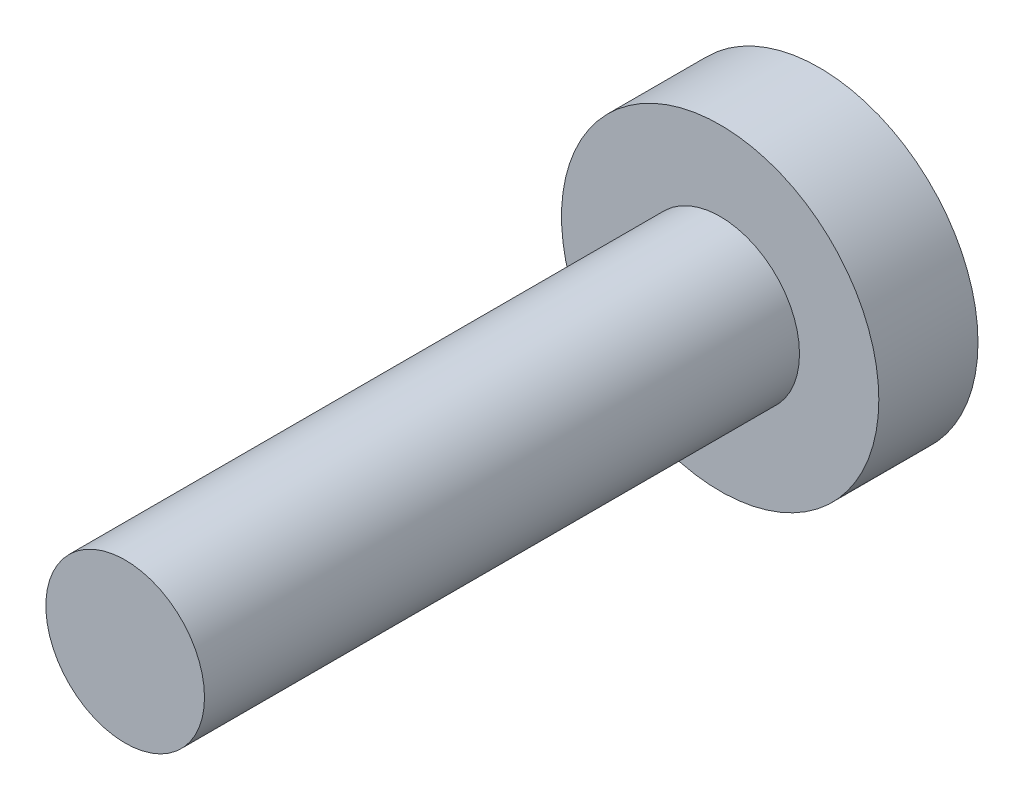
ISO-10303-21;
HEADER;
FILE_DESCRIPTION(('STEP AP214'),'2;1');
FILE_NAME('part.step','',(''),(''),'','','');
FILE_SCHEMA(('AUTOMOTIVE_DESIGN { 1 0 10303 214 1 1 1 1 }'));
ENDSEC;
DATA;
#1=APPLICATION_CONTEXT('core data for automotive mechanical design processes');
#2=APPLICATION_PROTOCOL_DEFINITION('international standard','automotive_design',2000,#1);
#3=PRODUCT_CONTEXT('',#1,'mechanical');
#4=PRODUCT('Part','Part','',(#3));
#5=PRODUCT_RELATED_PRODUCT_CATEGORY('part','',(#4));
#6=PRODUCT_DEFINITION_FORMATION('','',#4);
#7=PRODUCT_DEFINITION_CONTEXT('part definition',#1,'design');
#8=PRODUCT_DEFINITION('design','',#6,#7);
#9=PRODUCT_DEFINITION_SHAPE('','',#8);
#10=(LENGTH_UNIT() NAMED_UNIT(*) SI_UNIT(.MILLI.,.METRE.));
#11=(NAMED_UNIT(*) PLANE_ANGLE_UNIT() SI_UNIT($,.RADIAN.));
#12=(NAMED_UNIT(*) SI_UNIT($,.STERADIAN.) SOLID_ANGLE_UNIT());
#13=UNCERTAINTY_MEASURE_WITH_UNIT(LENGTH_MEASURE(1.E-05),#10,'distance_accuracy_value','');
#14=(GEOMETRIC_REPRESENTATION_CONTEXT(3) GLOBAL_UNCERTAINTY_ASSIGNED_CONTEXT((#13)) GLOBAL_UNIT_ASSIGNED_CONTEXT((#10,
#11,#12)) REPRESENTATION_CONTEXT('',''));
#15=CARTESIAN_POINT('',(0.,0.,0.));
#16=DIRECTION('',(0.,0.,1.));
#17=DIRECTION('',(1.,0.,0.));
#18=AXIS2_PLACEMENT_3D('',#15,#16,#17);
#19=CARTESIAN_POINT('',(0.,0.,5.));
#20=DIRECTION('',(0.,0.,-1.));
#21=DIRECTION('',(-1.,0.,0.));
#22=AXIS2_PLACEMENT_3D('',#19,#20,#21);
#23=CYLINDRICAL_SURFACE('',#22,8.);
#24=CARTESIAN_POINT('',(0.,0.,5.));
#25=DIRECTION('',(0.,0.,1.));
#26=DIRECTION('',(1.,0.,0.));
#27=AXIS2_PLACEMENT_3D('',#24,#25,#26);
#28=CIRCLE('',#27,8.);
#29=CARTESIAN_POINT('',(8.,0.,5.));
#30=VERTEX_POINT('',#29);
#31=EDGE_CURVE('E42',#30,#30,#28,.T.);
#32=ORIENTED_EDGE('',*,*,#31,.F.);
#33=EDGE_LOOP('',(#32));
#34=FACE_BOUND('',#33,.T.);
#35=CARTESIAN_POINT('',(0.,0.,0.));
#36=DIRECTION('',(0.,0.,1.));
#37=DIRECTION('',(1.,0.,0.));
#38=AXIS2_PLACEMENT_3D('',#35,#36,#37);
#39=CIRCLE('',#38,8.);
#40=CARTESIAN_POINT('',(8.,0.,0.));
#41=VERTEX_POINT('',#40);
#42=EDGE_CURVE('E37',#41,#41,#39,.T.);
#43=ORIENTED_EDGE('',*,*,#42,.T.);
#44=EDGE_LOOP('',(#43));
#45=FACE_BOUND('',#44,.T.);
#46=ADVANCED_FACE('F40',(#34,#45),#23,.T.);
#47=CARTESIAN_POINT('',(0.,0.,5.));
#48=DIRECTION('',(0.,0.,1.));
#49=DIRECTION('',(1.,0.,0.));
#50=AXIS2_PLACEMENT_3D('',#47,#48,#49);
#51=PLANE('',#50);
#52=CARTESIAN_POINT('',(0.,0.,5.));
#53=DIRECTION('',(0.,0.,1.));
#54=DIRECTION('',(1.,0.,0.));
#55=AXIS2_PLACEMENT_3D('',#52,#53,#54);
#56=CIRCLE('',#55,4.);
#57=CARTESIAN_POINT('',(4.,0.,5.));
#58=VERTEX_POINT('',#57);
#59=EDGE_CURVE('E10',#58,#58,#56,.T.);
#60=ORIENTED_EDGE('',*,*,#59,.F.);
#61=EDGE_LOOP('',(#60));
#62=FACE_BOUND('',#61,.T.);
#63=ORIENTED_EDGE('',*,*,#31,.T.);
#64=EDGE_LOOP('',(#63));
#65=FACE_BOUND('',#64,.T.);
#66=ADVANCED_FACE('F63',(#62,#65),#51,.T.);
#67=CARTESIAN_POINT('',(0.,0.,0.));
#68=DIRECTION('',(0.,0.,1.));
#69=DIRECTION('',(1.,0.,0.));
#70=AXIS2_PLACEMENT_3D('',#67,#68,#69);
#71=PLANE('',#70);
#72=ORIENTED_EDGE('',*,*,#42,.F.);
#73=EDGE_LOOP('',(#72));
#74=FACE_BOUND('',#73,.T.);
#75=ADVANCED_FACE('F59',(#74),#71,.F.);
#76=CARTESIAN_POINT('',(0.,0.,35.));
#77=DIRECTION('',(0.,0.,-1.));
#78=DIRECTION('',(-1.,0.,0.));
#79=AXIS2_PLACEMENT_3D('',#76,#77,#78);
#80=CYLINDRICAL_SURFACE('',#79,4.);
#81=CARTESIAN_POINT('',(0.,0.,35.));
#82=DIRECTION('',(0.,0.,1.));
#83=DIRECTION('',(1.,0.,0.));
#84=AXIS2_PLACEMENT_3D('',#81,#82,#83);
#85=CIRCLE('',#84,4.);
#86=CARTESIAN_POINT('',(4.,0.,35.));
#87=VERTEX_POINT('',#86);
#88=EDGE_CURVE('E49',#87,#87,#85,.T.);
#89=ORIENTED_EDGE('',*,*,#88,.F.);
#90=EDGE_LOOP('',(#89));
#91=FACE_BOUND('',#90,.T.);
#92=ORIENTED_EDGE('',*,*,#59,.T.);
#93=EDGE_LOOP('',(#92));
#94=FACE_BOUND('',#93,.T.);
#95=ADVANCED_FACE('F58',(#91,#94),#80,.T.);
#96=CARTESIAN_POINT('',(0.,0.,35.));
#97=DIRECTION('',(0.,0.,1.));
#98=DIRECTION('',(1.,0.,0.));
#99=AXIS2_PLACEMENT_3D('',#96,#97,#98);
#100=PLANE('',#99);
#101=ORIENTED_EDGE('',*,*,#88,.T.);
#102=EDGE_LOOP('',(#101));
#103=FACE_BOUND('',#102,.T.);
#104=ADVANCED_FACE('F70',(#103),#100,.T.);
#105=CLOSED_SHELL('',(#46,#66,#75,#95,#104));
#106=MANIFOLD_SOLID_BREP('B2',#105);
#107=ADVANCED_BREP_SHAPE_REPRESENTATION('',(#18,#106),#14);
#108=SHAPE_DEFINITION_REPRESENTATION(#9,#107);
ENDSEC;
END-ISO-10303-21;
